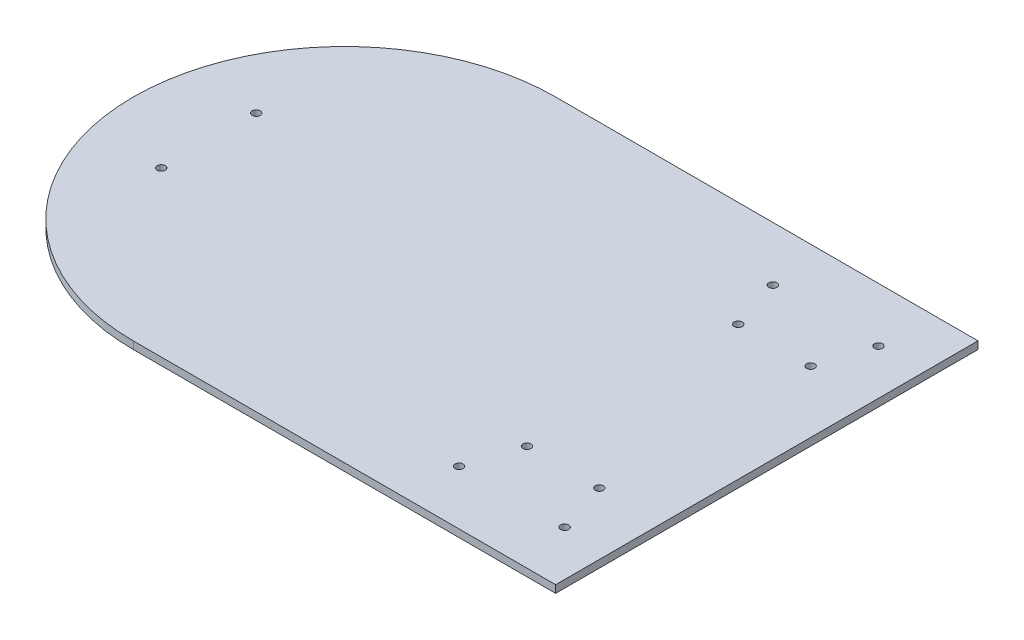
ISO-10303-21;
HEADER;
FILE_DESCRIPTION(('STEP AP214'),'2;1');
FILE_NAME('part.step','',(''),(''),'','','');
FILE_SCHEMA(('AUTOMOTIVE_DESIGN { 1 0 10303 214 1 1 1 1 }'));
ENDSEC;
DATA;
#1=APPLICATION_CONTEXT('core data for automotive mechanical design processes');
#2=APPLICATION_PROTOCOL_DEFINITION('international standard','automotive_design',2000,#1);
#3=PRODUCT_CONTEXT('',#1,'mechanical');
#4=PRODUCT('Part','Part','',(#3));
#5=PRODUCT_RELATED_PRODUCT_CATEGORY('part','',(#4));
#6=PRODUCT_DEFINITION_FORMATION('','',#4);
#7=PRODUCT_DEFINITION_CONTEXT('part definition',#1,'design');
#8=PRODUCT_DEFINITION('design','',#6,#7);
#9=PRODUCT_DEFINITION_SHAPE('','',#8);
#10=(LENGTH_UNIT() NAMED_UNIT(*) SI_UNIT(.MILLI.,.METRE.));
#11=(NAMED_UNIT(*) PLANE_ANGLE_UNIT() SI_UNIT($,.RADIAN.));
#12=(NAMED_UNIT(*) SI_UNIT($,.STERADIAN.) SOLID_ANGLE_UNIT());
#13=UNCERTAINTY_MEASURE_WITH_UNIT(LENGTH_MEASURE(1.E-05),#10,'distance_accuracy_value','');
#14=(GEOMETRIC_REPRESENTATION_CONTEXT(3) GLOBAL_UNCERTAINTY_ASSIGNED_CONTEXT((#13)) GLOBAL_UNIT_ASSIGNED_CONTEXT((#10,
#11,#12)) REPRESENTATION_CONTEXT('',''));
#15=CARTESIAN_POINT('',(0.,0.,0.));
#16=DIRECTION('',(0.,0.,1.));
#17=DIRECTION('',(1.,0.,0.));
#18=AXIS2_PLACEMENT_3D('',#15,#16,#17);
#19=CARTESIAN_POINT('',(0.,3.175,0.));
#20=DIRECTION('',(0.,0.,-1.));
#21=DIRECTION('',(-1.,0.,0.));
#22=AXIS2_PLACEMENT_3D('',#19,#20,#21);
#23=PLANE('',#22);
#24=DIRECTION('',(1.,0.,0.));
#25=VECTOR('',#24,1.);
#26=CARTESIAN_POINT('',(0.,0.,0.));
#27=LINE('',#26,#25);
#28=CARTESIAN_POINT('',(-177.8,0.,0.));
#29=VERTEX_POINT('',#28);
#30=CARTESIAN_POINT('',(0.,0.,0.));
#31=VERTEX_POINT('',#30);
#32=EDGE_CURVE('E107',#29,#31,#27,.T.);
#33=ORIENTED_EDGE('',*,*,#32,.T.);
#34=DIRECTION('',(0.,-1.,0.));
#35=VECTOR('',#34,1.);
#36=CARTESIAN_POINT('',(0.,3.175,0.));
#37=LINE('',#36,#35);
#38=CARTESIAN_POINT('',(0.,3.175,0.));
#39=VERTEX_POINT('',#38);
#40=EDGE_CURVE('E11',#39,#31,#37,.T.);
#41=ORIENTED_EDGE('',*,*,#40,.F.);
#42=DIRECTION('',(1.,0.,0.));
#43=VECTOR('',#42,1.);
#44=CARTESIAN_POINT('',(0.,3.175,0.));
#45=LINE('',#44,#43);
#46=CARTESIAN_POINT('',(-177.8,3.175,0.));
#47=VERTEX_POINT('',#46);
#48=EDGE_CURVE('E91',#47,#39,#45,.T.);
#49=ORIENTED_EDGE('',*,*,#48,.F.);
#50=DIRECTION('',(0.,-1.,0.));
#51=VECTOR('',#50,1.);
#52=CARTESIAN_POINT('',(-177.8,3.175,0.));
#53=LINE('',#52,#51);
#54=EDGE_CURVE('E103',#47,#29,#53,.T.);
#55=ORIENTED_EDGE('',*,*,#54,.T.);
#56=EDGE_LOOP('',(#33,#41,#49,#55));
#57=FACE_BOUND('',#56,.T.);
#58=ADVANCED_FACE('F39',(#57),#23,.F.);
#59=CARTESIAN_POINT('',(0.,3.175,0.));
#60=DIRECTION('',(-1.,0.,0.));
#61=DIRECTION('',(0.,0.,1.));
#62=AXIS2_PLACEMENT_3D('',#59,#60,#61);
#63=PLANE('',#62);
#64=DIRECTION('',(0.,0.,-1.));
#65=VECTOR('',#64,1.);
#66=CARTESIAN_POINT('',(0.,0.,0.));
#67=LINE('',#66,#65);
#68=CARTESIAN_POINT('',(0.,0.,-177.8));
#69=VERTEX_POINT('',#68);
#70=EDGE_CURVE('E96',#31,#69,#67,.T.);
#71=ORIENTED_EDGE('',*,*,#70,.T.);
#72=DIRECTION('',(0.,-1.,0.));
#73=VECTOR('',#72,1.);
#74=CARTESIAN_POINT('',(0.,3.175,-177.8));
#75=LINE('',#74,#73);
#76=CARTESIAN_POINT('',(0.,3.175,-177.8));
#77=VERTEX_POINT('',#76);
#78=EDGE_CURVE('E48',#77,#69,#75,.T.);
#79=ORIENTED_EDGE('',*,*,#78,.F.);
#80=DIRECTION('',(0.,0.,-1.));
#81=VECTOR('',#80,1.);
#82=CARTESIAN_POINT('',(0.,3.175,0.));
#83=LINE('',#82,#81);
#84=EDGE_CURVE('E86',#39,#77,#83,.T.);
#85=ORIENTED_EDGE('',*,*,#84,.F.);
#86=ORIENTED_EDGE('',*,*,#40,.T.);
#87=EDGE_LOOP('',(#71,#79,#85,#86));
#88=FACE_BOUND('',#87,.T.);
#89=ADVANCED_FACE('F95',(#88),#63,.F.);
#90=CARTESIAN_POINT('',(0.,3.175,-177.8));
#91=DIRECTION('',(0.,0.,1.));
#92=DIRECTION('',(1.,0.,0.));
#93=AXIS2_PLACEMENT_3D('',#90,#91,#92);
#94=PLANE('',#93);
#95=DIRECTION('',(-1.,0.,0.));
#96=VECTOR('',#95,1.);
#97=CARTESIAN_POINT('',(0.,0.,-177.8));
#98=LINE('',#97,#96);
#99=CARTESIAN_POINT('',(-177.8,0.,-177.8));
#100=VERTEX_POINT('',#99);
#101=EDGE_CURVE('E73',#69,#100,#98,.T.);
#102=ORIENTED_EDGE('',*,*,#101,.T.);
#103=DIRECTION('',(0.,-1.,0.));
#104=VECTOR('',#103,1.);
#105=CARTESIAN_POINT('',(-177.8,3.175,-177.8));
#106=LINE('',#105,#104);
#107=CARTESIAN_POINT('',(-177.8,3.175,-177.8));
#108=VERTEX_POINT('',#107);
#109=EDGE_CURVE('E98',#108,#100,#106,.T.);
#110=ORIENTED_EDGE('',*,*,#109,.F.);
#111=DIRECTION('',(-1.,0.,0.));
#112=VECTOR('',#111,1.);
#113=CARTESIAN_POINT('',(0.,3.175,-177.8));
#114=LINE('',#113,#112);
#115=EDGE_CURVE('E89',#77,#108,#114,.T.);
#116=ORIENTED_EDGE('',*,*,#115,.F.);
#117=ORIENTED_EDGE('',*,*,#78,.T.);
#118=EDGE_LOOP('',(#102,#110,#116,#117));
#119=FACE_BOUND('',#118,.T.);
#120=ADVANCED_FACE('F99',(#119),#94,.F.);
#121=CARTESIAN_POINT('',(-177.8,3.175,-88.8999999999999));
#122=DIRECTION('',(0.,-1.,0.));
#123=DIRECTION('',(0.,0.,-1.));
#124=AXIS2_PLACEMENT_3D('',#121,#122,#123);
#125=CYLINDRICAL_SURFACE('',#124,88.9);
#126=CARTESIAN_POINT('',(-177.8,0.,-88.8999999999999));
#127=DIRECTION('',(0.,1.,0.));
#128=DIRECTION('',(0.,0.,1.));
#129=AXIS2_PLACEMENT_3D('',#126,#127,#128);
#130=CIRCLE('',#129,88.9);
#131=EDGE_CURVE('E79',#100,#29,#130,.T.);
#132=ORIENTED_EDGE('',*,*,#131,.T.);
#133=ORIENTED_EDGE('',*,*,#54,.F.);
#134=CARTESIAN_POINT('',(-177.8,3.175,-88.8999999999999));
#135=DIRECTION('',(0.,1.,0.));
#136=DIRECTION('',(0.,0.,1.));
#137=AXIS2_PLACEMENT_3D('',#134,#135,#136);
#138=CIRCLE('',#137,88.9);
#139=EDGE_CURVE('E56',#108,#47,#138,.T.);
#140=ORIENTED_EDGE('',*,*,#139,.F.);
#141=ORIENTED_EDGE('',*,*,#109,.T.);
#142=EDGE_LOOP('',(#132,#133,#140,#141));
#143=FACE_BOUND('',#142,.T.);
#144=ADVANCED_FACE('F121',(#143),#125,.T.);
#145=CARTESIAN_POINT('',(-177.8,3.175,-88.8999999999999));
#146=DIRECTION('',(0.,1.,0.));
#147=DIRECTION('',(0.,0.,1.));
#148=AXIS2_PLACEMENT_3D('',#145,#146,#147);
#149=PLANE('',#148);
#150=CARTESIAN_POINT('',(-63.5,3.175,-154.95524));
#151=DIRECTION('',(0.,1.,0.));
#152=DIRECTION('',(0.,0.,1.));
#153=AXIS2_PLACEMENT_3D('',#150,#151,#152);
#154=CIRCLE('',#153,1.69999999999999);
#155=CARTESIAN_POINT('',(-63.5,3.175,-153.25524));
#156=VERTEX_POINT('',#155);
#157=EDGE_CURVE('E203',#156,#156,#154,.T.);
#158=ORIENTED_EDGE('',*,*,#157,.F.);
#159=EDGE_LOOP('',(#158));
#160=FACE_BOUND('',#159,.T.);
#161=CARTESIAN_POINT('',(-19.05,3.175,-154.95524));
#162=DIRECTION('',(0.,1.,0.));
#163=DIRECTION('',(0.,0.,1.));
#164=AXIS2_PLACEMENT_3D('',#161,#162,#163);
#165=CIRCLE('',#164,1.69999999999999);
#166=CARTESIAN_POINT('',(-19.05,3.175,-153.25524));
#167=VERTEX_POINT('',#166);
#168=EDGE_CURVE('E195',#167,#167,#165,.T.);
#169=ORIENTED_EDGE('',*,*,#168,.F.);
#170=EDGE_LOOP('',(#169));
#171=FACE_BOUND('',#170,.T.);
#172=CARTESIAN_POINT('',(-56.515,3.175,-133.36524));
#173=DIRECTION('',(0.,1.,0.));
#174=DIRECTION('',(0.,0.,1.));
#175=AXIS2_PLACEMENT_3D('',#172,#173,#174);
#176=CIRCLE('',#175,1.69999999999999);
#177=CARTESIAN_POINT('',(-56.515,3.175,-131.66524));
#178=VERTEX_POINT('',#177);
#179=EDGE_CURVE('E187',#178,#178,#176,.T.);
#180=ORIENTED_EDGE('',*,*,#179,.F.);
#181=EDGE_LOOP('',(#180));
#182=FACE_BOUND('',#181,.T.);
#183=CARTESIAN_POINT('',(-26.035,3.175,-133.36524));
#184=DIRECTION('',(0.,1.,0.));
#185=DIRECTION('',(0.,0.,1.));
#186=AXIS2_PLACEMENT_3D('',#183,#184,#185);
#187=CIRCLE('',#186,1.69999999999999);
#188=CARTESIAN_POINT('',(-26.035,3.175,-131.66524));
#189=VERTEX_POINT('',#188);
#190=EDGE_CURVE('E179',#189,#189,#187,.T.);
#191=ORIENTED_EDGE('',*,*,#190,.F.);
#192=EDGE_LOOP('',(#191));
#193=FACE_BOUND('',#192,.T.);
#194=CARTESIAN_POINT('',(-56.515,3.175,-44.43476));
#195=DIRECTION('',(0.,1.,0.));
#196=DIRECTION('',(0.,0.,1.));
#197=AXIS2_PLACEMENT_3D('',#194,#195,#196);
#198=CIRCLE('',#197,1.69999999999999);
#199=CARTESIAN_POINT('',(-56.515,3.175,-42.73476));
#200=VERTEX_POINT('',#199);
#201=EDGE_CURVE('E171',#200,#200,#198,.T.);
#202=ORIENTED_EDGE('',*,*,#201,.F.);
#203=EDGE_LOOP('',(#202));
#204=FACE_BOUND('',#203,.T.);
#205=CARTESIAN_POINT('',(-26.035,3.175,-44.43476));
#206=DIRECTION('',(0.,1.,0.));
#207=DIRECTION('',(0.,0.,1.));
#208=AXIS2_PLACEMENT_3D('',#205,#206,#207);
#209=CIRCLE('',#208,1.69999999999999);
#210=CARTESIAN_POINT('',(-26.035,3.175,-42.73476));
#211=VERTEX_POINT('',#210);
#212=EDGE_CURVE('E163',#211,#211,#209,.T.);
#213=ORIENTED_EDGE('',*,*,#212,.F.);
#214=EDGE_LOOP('',(#213));
#215=FACE_BOUND('',#214,.T.);
#216=CARTESIAN_POINT('',(-63.5,3.175,-22.8447599999999));
#217=DIRECTION('',(0.,1.,0.));
#218=DIRECTION('',(0.,0.,1.));
#219=AXIS2_PLACEMENT_3D('',#216,#217,#218);
#220=CIRCLE('',#219,1.69999999999999);
#221=CARTESIAN_POINT('',(-63.5,3.175,-21.1447599999999));
#222=VERTEX_POINT('',#221);
#223=EDGE_CURVE('E155',#222,#222,#220,.T.);
#224=ORIENTED_EDGE('',*,*,#223,.F.);
#225=EDGE_LOOP('',(#224));
#226=FACE_BOUND('',#225,.T.);
#227=CARTESIAN_POINT('',(-19.05,3.175,-22.8447599999999));
#228=DIRECTION('',(0.,1.,0.));
#229=DIRECTION('',(0.,0.,1.));
#230=AXIS2_PLACEMENT_3D('',#227,#228,#229);
#231=CIRCLE('',#230,1.69999999999999);
#232=CARTESIAN_POINT('',(-19.05,3.175,-21.1447599999999));
#233=VERTEX_POINT('',#232);
#234=EDGE_CURVE('E147',#233,#233,#231,.T.);
#235=ORIENTED_EDGE('',*,*,#234,.F.);
#236=EDGE_LOOP('',(#235));
#237=FACE_BOUND('',#236,.T.);
#238=CARTESIAN_POINT('',(-234.95,3.175,-108.9));
#239=DIRECTION('',(0.,1.,0.));
#240=DIRECTION('',(0.,0.,1.));
#241=AXIS2_PLACEMENT_3D('',#238,#239,#240);
#242=CIRCLE('',#241,1.69999999999998);
#243=CARTESIAN_POINT('',(-234.95,3.175,-107.2));
#244=VERTEX_POINT('',#243);
#245=EDGE_CURVE('E139',#244,#244,#242,.T.);
#246=ORIENTED_EDGE('',*,*,#245,.F.);
#247=EDGE_LOOP('',(#246));
#248=FACE_BOUND('',#247,.T.);
#249=CARTESIAN_POINT('',(-234.95,3.175,-68.8999999999999));
#250=DIRECTION('',(0.,1.,0.));
#251=DIRECTION('',(0.,0.,1.));
#252=AXIS2_PLACEMENT_3D('',#249,#250,#251);
#253=CIRCLE('',#252,1.69999999999998);
#254=CARTESIAN_POINT('',(-234.95,3.175,-67.2));
#255=VERTEX_POINT('',#254);
#256=EDGE_CURVE('E131',#255,#255,#253,.T.);
#257=ORIENTED_EDGE('',*,*,#256,.F.);
#258=EDGE_LOOP('',(#257));
#259=FACE_BOUND('',#258,.T.);
#260=ORIENTED_EDGE('',*,*,#48,.T.);
#261=ORIENTED_EDGE('',*,*,#84,.T.);
#262=ORIENTED_EDGE('',*,*,#115,.T.);
#263=ORIENTED_EDGE('',*,*,#139,.T.);
#264=EDGE_LOOP('',(#260,#261,#262,#263));
#265=FACE_BOUND('',#264,.T.);
#266=ADVANCED_FACE('F87',(#160,#171,#182,#193,#204,#215,#226,#237,#248,#259,#265),#149,.T.);
#267=CARTESIAN_POINT('',(-177.8,0.,-88.8999999999999));
#268=DIRECTION('',(0.,1.,0.));
#269=DIRECTION('',(0.,0.,1.));
#270=AXIS2_PLACEMENT_3D('',#267,#268,#269);
#271=PLANE('',#270);
#272=CARTESIAN_POINT('',(-63.5,0.,-154.95524));
#273=DIRECTION('',(0.,1.,0.));
#274=DIRECTION('',(0.,0.,1.));
#275=AXIS2_PLACEMENT_3D('',#272,#273,#274);
#276=CIRCLE('',#275,1.7);
#277=CARTESIAN_POINT('',(-63.5,0.,-153.25524));
#278=VERTEX_POINT('',#277);
#279=EDGE_CURVE('E199',#278,#278,#276,.T.);
#280=ORIENTED_EDGE('',*,*,#279,.T.);
#281=EDGE_LOOP('',(#280));
#282=FACE_BOUND('',#281,.T.);
#283=CARTESIAN_POINT('',(-19.05,0.,-154.95524));
#284=DIRECTION('',(0.,1.,0.));
#285=DIRECTION('',(0.,0.,1.));
#286=AXIS2_PLACEMENT_3D('',#283,#284,#285);
#287=CIRCLE('',#286,1.7);
#288=CARTESIAN_POINT('',(-19.05,0.,-153.25524));
#289=VERTEX_POINT('',#288);
#290=EDGE_CURVE('E191',#289,#289,#287,.T.);
#291=ORIENTED_EDGE('',*,*,#290,.T.);
#292=EDGE_LOOP('',(#291));
#293=FACE_BOUND('',#292,.T.);
#294=CARTESIAN_POINT('',(-56.515,0.,-133.36524));
#295=DIRECTION('',(0.,1.,0.));
#296=DIRECTION('',(0.,0.,1.));
#297=AXIS2_PLACEMENT_3D('',#294,#295,#296);
#298=CIRCLE('',#297,1.7);
#299=CARTESIAN_POINT('',(-56.515,0.,-131.66524));
#300=VERTEX_POINT('',#299);
#301=EDGE_CURVE('E183',#300,#300,#298,.T.);
#302=ORIENTED_EDGE('',*,*,#301,.T.);
#303=EDGE_LOOP('',(#302));
#304=FACE_BOUND('',#303,.T.);
#305=CARTESIAN_POINT('',(-26.035,0.,-133.36524));
#306=DIRECTION('',(0.,1.,0.));
#307=DIRECTION('',(0.,0.,1.));
#308=AXIS2_PLACEMENT_3D('',#305,#306,#307);
#309=CIRCLE('',#308,1.7);
#310=CARTESIAN_POINT('',(-26.035,0.,-131.66524));
#311=VERTEX_POINT('',#310);
#312=EDGE_CURVE('E175',#311,#311,#309,.T.);
#313=ORIENTED_EDGE('',*,*,#312,.T.);
#314=EDGE_LOOP('',(#313));
#315=FACE_BOUND('',#314,.T.);
#316=CARTESIAN_POINT('',(-56.515,0.,-44.43476));
#317=DIRECTION('',(0.,1.,0.));
#318=DIRECTION('',(0.,0.,1.));
#319=AXIS2_PLACEMENT_3D('',#316,#317,#318);
#320=CIRCLE('',#319,1.7);
#321=CARTESIAN_POINT('',(-56.515,0.,-42.73476));
#322=VERTEX_POINT('',#321);
#323=EDGE_CURVE('E167',#322,#322,#320,.T.);
#324=ORIENTED_EDGE('',*,*,#323,.T.);
#325=EDGE_LOOP('',(#324));
#326=FACE_BOUND('',#325,.T.);
#327=CARTESIAN_POINT('',(-26.035,0.,-44.43476));
#328=DIRECTION('',(0.,1.,0.));
#329=DIRECTION('',(0.,0.,1.));
#330=AXIS2_PLACEMENT_3D('',#327,#328,#329);
#331=CIRCLE('',#330,1.7);
#332=CARTESIAN_POINT('',(-26.035,0.,-42.73476));
#333=VERTEX_POINT('',#332);
#334=EDGE_CURVE('E159',#333,#333,#331,.T.);
#335=ORIENTED_EDGE('',*,*,#334,.T.);
#336=EDGE_LOOP('',(#335));
#337=FACE_BOUND('',#336,.T.);
#338=CARTESIAN_POINT('',(-63.5,0.,-22.8447599999999));
#339=DIRECTION('',(0.,1.,0.));
#340=DIRECTION('',(0.,0.,1.));
#341=AXIS2_PLACEMENT_3D('',#338,#339,#340);
#342=CIRCLE('',#341,1.7);
#343=CARTESIAN_POINT('',(-63.5,0.,-21.1447599999999));
#344=VERTEX_POINT('',#343);
#345=EDGE_CURVE('E151',#344,#344,#342,.T.);
#346=ORIENTED_EDGE('',*,*,#345,.T.);
#347=EDGE_LOOP('',(#346));
#348=FACE_BOUND('',#347,.T.);
#349=CARTESIAN_POINT('',(-19.05,0.,-22.8447599999999));
#350=DIRECTION('',(0.,1.,0.));
#351=DIRECTION('',(0.,0.,1.));
#352=AXIS2_PLACEMENT_3D('',#349,#350,#351);
#353=CIRCLE('',#352,1.7);
#354=CARTESIAN_POINT('',(-19.05,0.,-21.1447599999999));
#355=VERTEX_POINT('',#354);
#356=EDGE_CURVE('E143',#355,#355,#353,.T.);
#357=ORIENTED_EDGE('',*,*,#356,.T.);
#358=EDGE_LOOP('',(#357));
#359=FACE_BOUND('',#358,.T.);
#360=CARTESIAN_POINT('',(-234.95,0.,-108.9));
#361=DIRECTION('',(0.,1.,0.));
#362=DIRECTION('',(0.,0.,1.));
#363=AXIS2_PLACEMENT_3D('',#360,#361,#362);
#364=CIRCLE('',#363,1.70000000000001);
#365=CARTESIAN_POINT('',(-234.95,0.,-107.2));
#366=VERTEX_POINT('',#365);
#367=EDGE_CURVE('E135',#366,#366,#364,.T.);
#368=ORIENTED_EDGE('',*,*,#367,.T.);
#369=EDGE_LOOP('',(#368));
#370=FACE_BOUND('',#369,.T.);
#371=CARTESIAN_POINT('',(-234.95,0.,-68.8999999999999));
#372=DIRECTION('',(0.,1.,0.));
#373=DIRECTION('',(0.,0.,1.));
#374=AXIS2_PLACEMENT_3D('',#371,#372,#373);
#375=CIRCLE('',#374,1.70000000000001);
#376=CARTESIAN_POINT('',(-234.95,0.,-67.1999999999999));
#377=VERTEX_POINT('',#376);
#378=EDGE_CURVE('E111',#377,#377,#375,.T.);
#379=ORIENTED_EDGE('',*,*,#378,.T.);
#380=EDGE_LOOP('',(#379));
#381=FACE_BOUND('',#380,.T.);
#382=ORIENTED_EDGE('',*,*,#32,.F.);
#383=ORIENTED_EDGE('',*,*,#131,.F.);
#384=ORIENTED_EDGE('',*,*,#101,.F.);
#385=ORIENTED_EDGE('',*,*,#70,.F.);
#386=EDGE_LOOP('',(#382,#383,#384,#385));
#387=FACE_BOUND('',#386,.T.);
#388=ADVANCED_FACE('F124',(#282,#293,#304,#315,#326,#337,#348,#359,#370,#381,#387),#271,.F.);
#389=CARTESIAN_POINT('',(-234.95,3.175,-68.8999999999999));
#390=DIRECTION('',(0.,1.,0.));
#391=DIRECTION('',(0.,0.,1.));
#392=AXIS2_PLACEMENT_3D('',#389,#390,#391);
#393=CYLINDRICAL_SURFACE('',#392,1.69999999999999);
#394=ORIENTED_EDGE('',*,*,#378,.F.);
#395=EDGE_LOOP('',(#394));
#396=FACE_BOUND('',#395,.T.);
#397=ORIENTED_EDGE('',*,*,#256,.T.);
#398=EDGE_LOOP('',(#397));
#399=FACE_BOUND('',#398,.T.);
#400=ADVANCED_FACE('F231',(#396,#399),#393,.F.);
#401=CARTESIAN_POINT('',(-234.95,3.175,-108.9));
#402=DIRECTION('',(0.,1.,0.));
#403=DIRECTION('',(0.,0.,1.));
#404=AXIS2_PLACEMENT_3D('',#401,#402,#403);
#405=CYLINDRICAL_SURFACE('',#404,1.69999999999999);
#406=ORIENTED_EDGE('',*,*,#367,.F.);
#407=EDGE_LOOP('',(#406));
#408=FACE_BOUND('',#407,.T.);
#409=ORIENTED_EDGE('',*,*,#245,.T.);
#410=EDGE_LOOP('',(#409));
#411=FACE_BOUND('',#410,.T.);
#412=ADVANCED_FACE('F233',(#408,#411),#405,.F.);
#413=CARTESIAN_POINT('',(-19.05,3.175,-22.8447599999999));
#414=DIRECTION('',(0.,1.,0.));
#415=DIRECTION('',(0.,0.,1.));
#416=AXIS2_PLACEMENT_3D('',#413,#414,#415);
#417=CYLINDRICAL_SURFACE('',#416,1.69999999999999);
#418=ORIENTED_EDGE('',*,*,#356,.F.);
#419=EDGE_LOOP('',(#418));
#420=FACE_BOUND('',#419,.T.);
#421=ORIENTED_EDGE('',*,*,#234,.T.);
#422=EDGE_LOOP('',(#421));
#423=FACE_BOUND('',#422,.T.);
#424=ADVANCED_FACE('F240',(#420,#423),#417,.F.);
#425=CARTESIAN_POINT('',(-63.5,3.175,-22.8447599999999));
#426=DIRECTION('',(0.,1.,0.));
#427=DIRECTION('',(0.,0.,1.));
#428=AXIS2_PLACEMENT_3D('',#425,#426,#427);
#429=CYLINDRICAL_SURFACE('',#428,1.69999999999999);
#430=ORIENTED_EDGE('',*,*,#345,.F.);
#431=EDGE_LOOP('',(#430));
#432=FACE_BOUND('',#431,.T.);
#433=ORIENTED_EDGE('',*,*,#223,.T.);
#434=EDGE_LOOP('',(#433));
#435=FACE_BOUND('',#434,.T.);
#436=ADVANCED_FACE('F287',(#432,#435),#429,.F.);
#437=CARTESIAN_POINT('',(-26.035,3.175,-44.43476));
#438=DIRECTION('',(0.,1.,0.));
#439=DIRECTION('',(0.,0.,1.));
#440=AXIS2_PLACEMENT_3D('',#437,#438,#439);
#441=CYLINDRICAL_SURFACE('',#440,1.69999999999999);
#442=ORIENTED_EDGE('',*,*,#334,.F.);
#443=EDGE_LOOP('',(#442));
#444=FACE_BOUND('',#443,.T.);
#445=ORIENTED_EDGE('',*,*,#212,.T.);
#446=EDGE_LOOP('',(#445));
#447=FACE_BOUND('',#446,.T.);
#448=ADVANCED_FACE('F297',(#444,#447),#441,.F.);
#449=CARTESIAN_POINT('',(-56.515,3.175,-44.43476));
#450=DIRECTION('',(0.,1.,0.));
#451=DIRECTION('',(0.,0.,1.));
#452=AXIS2_PLACEMENT_3D('',#449,#450,#451);
#453=CYLINDRICAL_SURFACE('',#452,1.69999999999999);
#454=ORIENTED_EDGE('',*,*,#323,.F.);
#455=EDGE_LOOP('',(#454));
#456=FACE_BOUND('',#455,.T.);
#457=ORIENTED_EDGE('',*,*,#201,.T.);
#458=EDGE_LOOP('',(#457));
#459=FACE_BOUND('',#458,.T.);
#460=ADVANCED_FACE('F307',(#456,#459),#453,.F.);
#461=CARTESIAN_POINT('',(-26.035,3.175,-133.36524));
#462=DIRECTION('',(0.,1.,0.));
#463=DIRECTION('',(0.,0.,1.));
#464=AXIS2_PLACEMENT_3D('',#461,#462,#463);
#465=CYLINDRICAL_SURFACE('',#464,1.69999999999999);
#466=ORIENTED_EDGE('',*,*,#312,.F.);
#467=EDGE_LOOP('',(#466));
#468=FACE_BOUND('',#467,.T.);
#469=ORIENTED_EDGE('',*,*,#190,.T.);
#470=EDGE_LOOP('',(#469));
#471=FACE_BOUND('',#470,.T.);
#472=ADVANCED_FACE('F317',(#468,#471),#465,.F.);
#473=CARTESIAN_POINT('',(-56.515,3.175,-133.36524));
#474=DIRECTION('',(0.,1.,0.));
#475=DIRECTION('',(0.,0.,1.));
#476=AXIS2_PLACEMENT_3D('',#473,#474,#475);
#477=CYLINDRICAL_SURFACE('',#476,1.69999999999999);
#478=ORIENTED_EDGE('',*,*,#301,.F.);
#479=EDGE_LOOP('',(#478));
#480=FACE_BOUND('',#479,.T.);
#481=ORIENTED_EDGE('',*,*,#179,.T.);
#482=EDGE_LOOP('',(#481));
#483=FACE_BOUND('',#482,.T.);
#484=ADVANCED_FACE('F327',(#480,#483),#477,.F.);
#485=CARTESIAN_POINT('',(-19.05,3.175,-154.95524));
#486=DIRECTION('',(0.,1.,0.));
#487=DIRECTION('',(0.,0.,1.));
#488=AXIS2_PLACEMENT_3D('',#485,#486,#487);
#489=CYLINDRICAL_SURFACE('',#488,1.69999999999999);
#490=ORIENTED_EDGE('',*,*,#290,.F.);
#491=EDGE_LOOP('',(#490));
#492=FACE_BOUND('',#491,.T.);
#493=ORIENTED_EDGE('',*,*,#168,.T.);
#494=EDGE_LOOP('',(#493));
#495=FACE_BOUND('',#494,.T.);
#496=ADVANCED_FACE('F337',(#492,#495),#489,.F.);
#497=CARTESIAN_POINT('',(-63.5,3.175,-154.95524));
#498=DIRECTION('',(0.,1.,0.));
#499=DIRECTION('',(0.,0.,1.));
#500=AXIS2_PLACEMENT_3D('',#497,#498,#499);
#501=CYLINDRICAL_SURFACE('',#500,1.69999999999999);
#502=ORIENTED_EDGE('',*,*,#279,.F.);
#503=EDGE_LOOP('',(#502));
#504=FACE_BOUND('',#503,.T.);
#505=ORIENTED_EDGE('',*,*,#157,.T.);
#506=EDGE_LOOP('',(#505));
#507=FACE_BOUND('',#506,.T.);
#508=ADVANCED_FACE('F208',(#504,#507),#501,.F.);
#509=CLOSED_SHELL('',(#58,#89,#120,#144,#266,#388,#400,#412,#424,#436,#448,#460,#472,#484,#496,#508));
#510=MANIFOLD_SOLID_BREP('B2',#509);
#511=ADVANCED_BREP_SHAPE_REPRESENTATION('',(#18,#510),#14);
#512=SHAPE_DEFINITION_REPRESENTATION(#9,#511);
ENDSEC;
END-ISO-10303-21;
